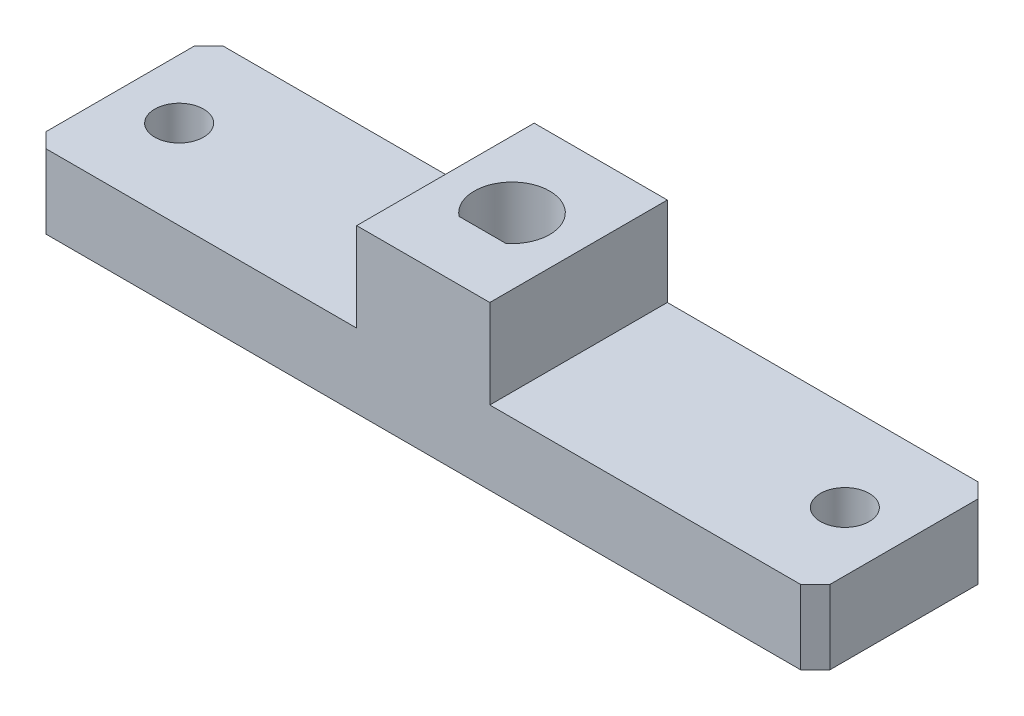
ISO-10303-21;
HEADER;
FILE_DESCRIPTION(('STEP AP214'),'2;1');
FILE_NAME('part.step','',(''),(''),'','','');
FILE_SCHEMA(('AUTOMOTIVE_DESIGN { 1 0 10303 214 1 1 1 1 }'));
ENDSEC;
DATA;
#1=APPLICATION_CONTEXT('core data for automotive mechanical design processes');
#2=APPLICATION_PROTOCOL_DEFINITION('international standard','automotive_design',2000,#1);
#3=PRODUCT_CONTEXT('',#1,'mechanical');
#4=PRODUCT('Part','Part','',(#3));
#5=PRODUCT_RELATED_PRODUCT_CATEGORY('part','',(#4));
#6=PRODUCT_DEFINITION_FORMATION('','',#4);
#7=PRODUCT_DEFINITION_CONTEXT('part definition',#1,'design');
#8=PRODUCT_DEFINITION('design','',#6,#7);
#9=PRODUCT_DEFINITION_SHAPE('','',#8);
#10=(LENGTH_UNIT() NAMED_UNIT(*) SI_UNIT(.MILLI.,.METRE.));
#11=(NAMED_UNIT(*) PLANE_ANGLE_UNIT() SI_UNIT($,.RADIAN.));
#12=(NAMED_UNIT(*) SI_UNIT($,.STERADIAN.) SOLID_ANGLE_UNIT());
#13=UNCERTAINTY_MEASURE_WITH_UNIT(LENGTH_MEASURE(1.E-05),#10,'distance_accuracy_value','');
#14=(GEOMETRIC_REPRESENTATION_CONTEXT(3) GLOBAL_UNCERTAINTY_ASSIGNED_CONTEXT((#13)) GLOBAL_UNIT_ASSIGNED_CONTEXT((#10,
#11,#12)) REPRESENTATION_CONTEXT('',''));
#15=CARTESIAN_POINT('',(0.,0.,0.));
#16=DIRECTION('',(0.,0.,1.));
#17=DIRECTION('',(1.,0.,0.));
#18=AXIS2_PLACEMENT_3D('',#15,#16,#17);
#19=CARTESIAN_POINT('',(4.5,11.,-12.));
#20=DIRECTION('',(0.,1.,0.));
#21=DIRECTION('',(0.,0.,1.));
#22=AXIS2_PLACEMENT_3D('',#19,#20,#21);
#23=PLANE('',#22);
#24=DIRECTION('',(-1.,0.,0.));
#25=VECTOR('',#24,1.);
#26=CARTESIAN_POINT('',(4.5,11.,0.));
#27=LINE('',#26,#25);
#28=CARTESIAN_POINT('',(4.5,11.,0.));
#29=VERTEX_POINT('',#28);
#30=CARTESIAN_POINT('',(-4.5,11.,0.));
#31=VERTEX_POINT('',#30);
#32=EDGE_CURVE('E229',#29,#31,#27,.T.);
#33=ORIENTED_EDGE('',*,*,#32,.F.);
#34=DIRECTION('',(0.,0.,1.));
#35=VECTOR('',#34,1.);
#36=CARTESIAN_POINT('',(4.5,11.,-12.));
#37=LINE('',#36,#35);
#38=CARTESIAN_POINT('',(4.5,11.,-12.));
#39=VERTEX_POINT('',#38);
#40=EDGE_CURVE('E251',#39,#29,#37,.T.);
#41=ORIENTED_EDGE('',*,*,#40,.F.);
#42=DIRECTION('',(-1.,0.,0.));
#43=VECTOR('',#42,1.);
#44=CARTESIAN_POINT('',(4.5,11.,-12.));
#45=LINE('',#44,#43);
#46=CARTESIAN_POINT('',(-4.5,11.,-12.));
#47=VERTEX_POINT('',#46);
#48=EDGE_CURVE('E205',#39,#47,#45,.T.);
#49=ORIENTED_EDGE('',*,*,#48,.T.);
#50=DIRECTION('',(0.,0.,1.));
#51=VECTOR('',#50,1.);
#52=CARTESIAN_POINT('',(-4.5,11.,-12.));
#53=LINE('',#52,#51);
#54=EDGE_CURVE('E248',#47,#31,#53,.T.);
#55=ORIENTED_EDGE('',*,*,#54,.T.);
#56=EDGE_LOOP('',(#33,#41,#49,#55));
#57=FACE_BOUND('',#56,.T.);
#58=DIRECTION('',(1.,0.,0.));
#59=VECTOR('',#58,1.);
#60=CARTESIAN_POINT('',(-1.58192920195564,11.,-4.));
#61=LINE('',#60,#59);
#62=CARTESIAN_POINT('',(-1.58192920195564,11.,-4.));
#63=VERTEX_POINT('',#62);
#64=CARTESIAN_POINT('',(1.58192920195564,11.,-4.));
#65=VERTEX_POINT('',#64);
#66=EDGE_CURVE('E146',#63,#65,#61,.T.);
#67=ORIENTED_EDGE('',*,*,#66,.F.);
#68=CARTESIAN_POINT('',(0.,11.,-6.));
#69=DIRECTION('',(0.,1.,0.));
#70=DIRECTION('',(0.,0.,1.));
#71=AXIS2_PLACEMENT_3D('',#68,#69,#70);
#72=CIRCLE('',#71,2.55);
#73=EDGE_CURVE('E157',#65,#63,#72,.T.);
#74=ORIENTED_EDGE('',*,*,#73,.F.);
#75=EDGE_LOOP('',(#67,#74));
#76=FACE_BOUND('',#75,.T.);
#77=ADVANCED_FACE('F44',(#57,#76),#23,.T.);
#78=CARTESIAN_POINT('',(-26.5,0.,-12.));
#79=DIRECTION('',(0.,-1.,0.));
#80=DIRECTION('',(0.,0.,-1.));
#81=AXIS2_PLACEMENT_3D('',#78,#79,#80);
#82=PLANE('',#81);
#83=CARTESIAN_POINT('',(-22.5,0.,-6.));
#84=DIRECTION('',(0.,-1.,0.));
#85=DIRECTION('',(0.,0.,-1.));
#86=AXIS2_PLACEMENT_3D('',#83,#84,#85);
#87=CIRCLE('',#86,2.025);
#88=CARTESIAN_POINT('',(-22.5,0.,-8.025));
#89=VERTEX_POINT('',#88);
#90=EDGE_CURVE('E175',#89,#89,#87,.T.);
#91=ORIENTED_EDGE('',*,*,#90,.F.);
#92=EDGE_LOOP('',(#91));
#93=FACE_BOUND('',#92,.T.);
#94=CARTESIAN_POINT('',(22.5,0.,-6.00000000000001));
#95=DIRECTION('',(0.,-1.,0.));
#96=DIRECTION('',(0.,0.,-1.));
#97=AXIS2_PLACEMENT_3D('',#94,#95,#96);
#98=CIRCLE('',#97,2.025);
#99=CARTESIAN_POINT('',(22.5,0.,-8.02500000000001));
#100=VERTEX_POINT('',#99);
#101=EDGE_CURVE('E184',#100,#100,#98,.T.);
#102=ORIENTED_EDGE('',*,*,#101,.F.);
#103=EDGE_LOOP('',(#102));
#104=FACE_BOUND('',#103,.T.);
#105=DIRECTION('',(0.,0.,1.));
#106=VECTOR('',#105,1.);
#107=CARTESIAN_POINT('',(-26.5,0.,-12.));
#108=LINE('',#107,#106);
#109=CARTESIAN_POINT('',(-26.5,0.,-11.));
#110=VERTEX_POINT('',#109);
#111=CARTESIAN_POINT('',(-26.5,0.,-1.));
#112=VERTEX_POINT('',#111);
#113=EDGE_CURVE('E217',#110,#112,#108,.T.);
#114=ORIENTED_EDGE('',*,*,#113,.F.);
#115=DIRECTION('',(0.707106781186549,0.,-0.707106781186546));
#116=VECTOR('',#115,1.);
#117=CARTESIAN_POINT('',(-26.,0.,-11.5));
#118=LINE('',#117,#116);
#119=CARTESIAN_POINT('',(-25.5,0.,-12.));
#120=VERTEX_POINT('',#119);
#121=EDGE_CURVE('E289',#110,#120,#118,.T.);
#122=ORIENTED_EDGE('',*,*,#121,.T.);
#123=DIRECTION('',(1.,0.,0.));
#124=VECTOR('',#123,1.);
#125=CARTESIAN_POINT('',(-26.5,0.,-12.));
#126=LINE('',#125,#124);
#127=CARTESIAN_POINT('',(25.5,0.,-12.));
#128=VERTEX_POINT('',#127);
#129=EDGE_CURVE('E193',#120,#128,#126,.T.);
#130=ORIENTED_EDGE('',*,*,#129,.T.);
#131=DIRECTION('',(0.70710678118655,0.,0.707106781186545));
#132=VECTOR('',#131,1.);
#133=CARTESIAN_POINT('',(-0.500000000000184,0.,-38.));
#134=LINE('',#133,#132);
#135=CARTESIAN_POINT('',(26.5,0.,-11.));
#136=VERTEX_POINT('',#135);
#137=EDGE_CURVE('E283',#128,#136,#134,.T.);
#138=ORIENTED_EDGE('',*,*,#137,.T.);
#139=DIRECTION('',(0.,0.,1.));
#140=VECTOR('',#139,1.);
#141=CARTESIAN_POINT('',(26.5,0.,-12.));
#142=LINE('',#141,#140);
#143=CARTESIAN_POINT('',(26.5,0.,-1.));
#144=VERTEX_POINT('',#143);
#145=EDGE_CURVE('E261',#136,#144,#142,.T.);
#146=ORIENTED_EDGE('',*,*,#145,.T.);
#147=DIRECTION('',(0.707106781186548,0.,-0.707106781186548));
#148=VECTOR('',#147,1.);
#149=CARTESIAN_POINT('',(5.5,0.,20.));
#150=LINE('',#149,#148);
#151=CARTESIAN_POINT('',(25.5,0.,0.));
#152=VERTEX_POINT('',#151);
#153=EDGE_CURVE('E280',#144,#152,#150,.F.);
#154=ORIENTED_EDGE('',*,*,#153,.T.);
#155=DIRECTION('',(1.,0.,0.));
#156=VECTOR('',#155,1.);
#157=CARTESIAN_POINT('',(-26.5,0.,0.));
#158=LINE('',#157,#156);
#159=CARTESIAN_POINT('',(-25.5,0.,0.));
#160=VERTEX_POINT('',#159);
#161=EDGE_CURVE('E218',#160,#152,#158,.T.);
#162=ORIENTED_EDGE('',*,*,#161,.F.);
#163=DIRECTION('',(0.707106781186544,0.,0.707106781186551));
#164=VECTOR('',#163,1.);
#165=CARTESIAN_POINT('',(-32.,0.,-6.50000000000006));
#166=LINE('',#165,#164);
#167=EDGE_CURVE('E286',#160,#112,#166,.F.);
#168=ORIENTED_EDGE('',*,*,#167,.T.);
#169=EDGE_LOOP('',(#114,#122,#130,#138,#146,#154,#162,#168));
#170=FACE_BOUND('',#169,.T.);
#171=DIRECTION('',(1.,0.,0.));
#172=VECTOR('',#171,1.);
#173=CARTESIAN_POINT('',(-1.58192920195564,0.,-4.));
#174=LINE('',#173,#172);
#175=CARTESIAN_POINT('',(-1.58192920195564,0.,-4.));
#176=VERTEX_POINT('',#175);
#177=CARTESIAN_POINT('',(1.58192920195564,0.,-4.));
#178=VERTEX_POINT('',#177);
#179=EDGE_CURVE('E166',#176,#178,#174,.T.);
#180=ORIENTED_EDGE('',*,*,#179,.T.);
#181=CARTESIAN_POINT('',(0.,0.,-6.));
#182=DIRECTION('',(0.,1.,0.));
#183=DIRECTION('',(0.,0.,1.));
#184=AXIS2_PLACEMENT_3D('',#181,#182,#183);
#185=CIRCLE('',#184,2.55);
#186=EDGE_CURVE('E162',#178,#176,#185,.T.);
#187=ORIENTED_EDGE('',*,*,#186,.T.);
#188=EDGE_LOOP('',(#180,#187));
#189=FACE_BOUND('',#188,.T.);
#190=ADVANCED_FACE('F334',(#93,#104,#170,#189),#82,.T.);
#191=CARTESIAN_POINT('',(-26.5,5.,-12.));
#192=DIRECTION('',(-1.,0.,0.));
#193=DIRECTION('',(0.,-1.,0.));
#194=AXIS2_PLACEMENT_3D('',#191,#192,#193);
#195=PLANE('',#194);
#196=DIRECTION('',(0.,0.,1.));
#197=VECTOR('',#196,1.);
#198=CARTESIAN_POINT('',(-26.5,5.,-12.));
#199=LINE('',#198,#197);
#200=CARTESIAN_POINT('',(-26.5,5.,-11.));
#201=VERTEX_POINT('',#200);
#202=CARTESIAN_POINT('',(-26.5,5.,-1.));
#203=VERTEX_POINT('',#202);
#204=EDGE_CURVE('E240',#201,#203,#199,.T.);
#205=ORIENTED_EDGE('',*,*,#204,.F.);
#206=DIRECTION('',(0.,-1.,0.));
#207=VECTOR('',#206,1.);
#208=CARTESIAN_POINT('',(-26.5,0.,-11.));
#209=LINE('',#208,#207);
#210=EDGE_CURVE('E276',#201,#110,#209,.T.);
#211=ORIENTED_EDGE('',*,*,#210,.T.);
#212=ORIENTED_EDGE('',*,*,#113,.T.);
#213=DIRECTION('',(0.,1.,0.));
#214=VECTOR('',#213,1.);
#215=CARTESIAN_POINT('',(-26.5,5.,-1.));
#216=LINE('',#215,#214);
#217=EDGE_CURVE('E244',#112,#203,#216,.T.);
#218=ORIENTED_EDGE('',*,*,#217,.T.);
#219=EDGE_LOOP('',(#205,#211,#212,#218));
#220=FACE_BOUND('',#219,.T.);
#221=ADVANCED_FACE('F348',(#220),#195,.T.);
#222=CARTESIAN_POINT('',(-4.5,5.,-12.));
#223=DIRECTION('',(0.,1.,0.));
#224=DIRECTION('',(-1.,0.,0.));
#225=AXIS2_PLACEMENT_3D('',#222,#223,#224);
#226=PLANE('',#225);
#227=CARTESIAN_POINT('',(-22.5,5.,-6.));
#228=DIRECTION('',(0.,1.,0.));
#229=DIRECTION('',(-1.,0.,0.));
#230=AXIS2_PLACEMENT_3D('',#227,#228,#229);
#231=CIRCLE('',#230,1.65);
#232=CARTESIAN_POINT('',(-24.15,5.,-6.));
#233=VERTEX_POINT('',#232);
#234=EDGE_CURVE('E183',#233,#233,#231,.T.);
#235=ORIENTED_EDGE('',*,*,#234,.F.);
#236=EDGE_LOOP('',(#235));
#237=FACE_BOUND('',#236,.T.);
#238=DIRECTION('',(-1.,0.,0.));
#239=VECTOR('',#238,1.);
#240=CARTESIAN_POINT('',(-4.5,5.,-12.));
#241=LINE('',#240,#239);
#242=CARTESIAN_POINT('',(-4.5,5.,-12.));
#243=VERTEX_POINT('',#242);
#244=CARTESIAN_POINT('',(-25.5,5.,-12.));
#245=VERTEX_POINT('',#244);
#246=EDGE_CURVE('E213',#243,#245,#241,.T.);
#247=ORIENTED_EDGE('',*,*,#246,.T.);
#248=DIRECTION('',(-0.707106781186549,0.,0.707106781186546));
#249=VECTOR('',#248,1.);
#250=CARTESIAN_POINT('',(-15.,5.,-22.5));
#251=LINE('',#250,#249);
#252=EDGE_CURVE('E301',#245,#201,#251,.T.);
#253=ORIENTED_EDGE('',*,*,#252,.T.);
#254=ORIENTED_EDGE('',*,*,#204,.T.);
#255=DIRECTION('',(-0.707106781186544,0.,-0.707106781186551));
#256=VECTOR('',#255,1.);
#257=CARTESIAN_POINT('',(-21.0000000000001,5.,4.49999999999994));
#258=LINE('',#257,#256);
#259=CARTESIAN_POINT('',(-25.5,5.,0.));
#260=VERTEX_POINT('',#259);
#261=EDGE_CURVE('E298',#203,#260,#258,.F.);
#262=ORIENTED_EDGE('',*,*,#261,.T.);
#263=DIRECTION('',(-1.,0.,0.));
#264=VECTOR('',#263,1.);
#265=CARTESIAN_POINT('',(-4.5,5.,0.));
#266=LINE('',#265,#264);
#267=CARTESIAN_POINT('',(-4.5,5.,0.));
#268=VERTEX_POINT('',#267);
#269=EDGE_CURVE('E198',#268,#260,#266,.T.);
#270=ORIENTED_EDGE('',*,*,#269,.F.);
#271=DIRECTION('',(0.,0.,1.));
#272=VECTOR('',#271,1.);
#273=CARTESIAN_POINT('',(-4.5,5.,-12.));
#274=LINE('',#273,#272);
#275=EDGE_CURVE('E245',#243,#268,#274,.T.);
#276=ORIENTED_EDGE('',*,*,#275,.F.);
#277=EDGE_LOOP('',(#247,#253,#254,#262,#270,#276));
#278=FACE_BOUND('',#277,.T.);
#279=ADVANCED_FACE('F345',(#237,#278),#226,.T.);
#280=CARTESIAN_POINT('',(-4.5,11.,-12.));
#281=DIRECTION('',(-1.,0.,0.));
#282=DIRECTION('',(0.,-1.,0.));
#283=AXIS2_PLACEMENT_3D('',#280,#281,#282);
#284=PLANE('',#283);
#285=DIRECTION('',(0.,-1.,0.));
#286=VECTOR('',#285,1.);
#287=CARTESIAN_POINT('',(-4.5,11.,0.));
#288=LINE('',#287,#286);
#289=EDGE_CURVE('E233',#31,#268,#288,.T.);
#290=ORIENTED_EDGE('',*,*,#289,.F.);
#291=ORIENTED_EDGE('',*,*,#54,.F.);
#292=DIRECTION('',(0.,-1.,0.));
#293=VECTOR('',#292,1.);
#294=CARTESIAN_POINT('',(-4.5,11.,-12.));
#295=LINE('',#294,#293);
#296=EDGE_CURVE('E209',#47,#243,#295,.T.);
#297=ORIENTED_EDGE('',*,*,#296,.T.);
#298=ORIENTED_EDGE('',*,*,#275,.T.);
#299=EDGE_LOOP('',(#290,#291,#297,#298));
#300=FACE_BOUND('',#299,.T.);
#301=ADVANCED_FACE('F360',(#300),#284,.T.);
#302=CARTESIAN_POINT('',(4.50000000000001,5.00000000000001,-12.));
#303=DIRECTION('',(1.,0.,0.));
#304=DIRECTION('',(0.,1.,0.));
#305=AXIS2_PLACEMENT_3D('',#302,#303,#304);
#306=PLANE('',#305);
#307=DIRECTION('',(0.,1.,0.));
#308=VECTOR('',#307,1.);
#309=CARTESIAN_POINT('',(4.50000000000001,5.00000000000001,0.));
#310=LINE('',#309,#308);
#311=CARTESIAN_POINT('',(4.50000000000001,5.00000000000001,0.));
#312=VERTEX_POINT('',#311);
#313=EDGE_CURVE('E225',#312,#29,#310,.T.);
#314=ORIENTED_EDGE('',*,*,#313,.F.);
#315=DIRECTION('',(0.,0.,1.));
#316=VECTOR('',#315,1.);
#317=CARTESIAN_POINT('',(4.50000000000001,5.00000000000001,-12.));
#318=LINE('',#317,#316);
#319=CARTESIAN_POINT('',(4.50000000000001,5.00000000000001,-12.));
#320=VERTEX_POINT('',#319);
#321=EDGE_CURVE('E254',#320,#312,#318,.T.);
#322=ORIENTED_EDGE('',*,*,#321,.F.);
#323=DIRECTION('',(0.,1.,0.));
#324=VECTOR('',#323,1.);
#325=CARTESIAN_POINT('',(4.50000000000001,5.00000000000001,-12.));
#326=LINE('',#325,#324);
#327=EDGE_CURVE('E201',#320,#39,#326,.T.);
#328=ORIENTED_EDGE('',*,*,#327,.T.);
#329=ORIENTED_EDGE('',*,*,#40,.T.);
#330=EDGE_LOOP('',(#314,#322,#328,#329));
#331=FACE_BOUND('',#330,.T.);
#332=ADVANCED_FACE('F365',(#331),#306,.T.);
#333=CARTESIAN_POINT('',(26.5,5.00000000000003,-12.));
#334=DIRECTION('',(0.,1.,0.));
#335=DIRECTION('',(-1.,0.,0.));
#336=AXIS2_PLACEMENT_3D('',#333,#334,#335);
#337=PLANE('',#336);
#338=CARTESIAN_POINT('',(22.5,5.00000000000003,-6.00000000000001));
#339=DIRECTION('',(0.,1.,0.));
#340=DIRECTION('',(-1.,0.,0.));
#341=AXIS2_PLACEMENT_3D('',#338,#339,#340);
#342=CIRCLE('',#341,1.65);
#343=CARTESIAN_POINT('',(20.85,5.00000000000003,-6.00000000000001));
#344=VERTEX_POINT('',#343);
#345=EDGE_CURVE('E192',#344,#344,#342,.T.);
#346=ORIENTED_EDGE('',*,*,#345,.F.);
#347=EDGE_LOOP('',(#346));
#348=FACE_BOUND('',#347,.T.);
#349=DIRECTION('',(0.,0.,1.));
#350=VECTOR('',#349,1.);
#351=CARTESIAN_POINT('',(26.5,5.00000000000003,-12.));
#352=LINE('',#351,#350);
#353=CARTESIAN_POINT('',(26.5,5.00000000000003,-11.));
#354=VERTEX_POINT('',#353);
#355=CARTESIAN_POINT('',(26.5,5.00000000000003,-1.));
#356=VERTEX_POINT('',#355);
#357=EDGE_CURVE('E258',#354,#356,#352,.T.);
#358=ORIENTED_EDGE('',*,*,#357,.F.);
#359=DIRECTION('',(-0.70710678118655,0.,-0.707106781186545));
#360=VECTOR('',#359,1.);
#361=CARTESIAN_POINT('',(26.,5.00000000000003,-11.5));
#362=LINE('',#361,#360);
#363=CARTESIAN_POINT('',(25.5,5.00000000000003,-12.));
#364=VERTEX_POINT('',#363);
#365=EDGE_CURVE('E11',#354,#364,#362,.T.);
#366=ORIENTED_EDGE('',*,*,#365,.T.);
#367=DIRECTION('',(-1.,0.,0.));
#368=VECTOR('',#367,1.);
#369=CARTESIAN_POINT('',(26.5,5.00000000000003,-12.));
#370=LINE('',#369,#368);
#371=EDGE_CURVE('E197',#364,#320,#370,.T.);
#372=ORIENTED_EDGE('',*,*,#371,.T.);
#373=ORIENTED_EDGE('',*,*,#321,.T.);
#374=DIRECTION('',(-1.,0.,0.));
#375=VECTOR('',#374,1.);
#376=CARTESIAN_POINT('',(26.5,5.00000000000003,0.));
#377=LINE('',#376,#375);
#378=CARTESIAN_POINT('',(25.5,5.00000000000003,0.));
#379=VERTEX_POINT('',#378);
#380=EDGE_CURVE('E222',#379,#312,#377,.T.);
#381=ORIENTED_EDGE('',*,*,#380,.F.);
#382=DIRECTION('',(-0.707106781186548,0.,0.707106781186548));
#383=VECTOR('',#382,1.);
#384=CARTESIAN_POINT('',(32.,5.00000000000004,-6.5));
#385=LINE('',#384,#383);
#386=EDGE_CURVE('E54',#379,#356,#385,.F.);
#387=ORIENTED_EDGE('',*,*,#386,.T.);
#388=EDGE_LOOP('',(#358,#366,#372,#373,#381,#387));
#389=FACE_BOUND('',#388,.T.);
#390=ADVANCED_FACE('F323',(#348,#389),#337,.T.);
#391=CARTESIAN_POINT('',(26.5,0.,-12.));
#392=DIRECTION('',(1.,0.,0.));
#393=DIRECTION('',(0.,1.,0.));
#394=AXIS2_PLACEMENT_3D('',#391,#392,#393);
#395=PLANE('',#394);
#396=ORIENTED_EDGE('',*,*,#145,.F.);
#397=DIRECTION('',(0.,1.,0.));
#398=VECTOR('',#397,1.);
#399=CARTESIAN_POINT('',(26.5,5.00000000000004,-11.));
#400=LINE('',#399,#398);
#401=EDGE_CURVE('E315',#136,#354,#400,.T.);
#402=ORIENTED_EDGE('',*,*,#401,.T.);
#403=ORIENTED_EDGE('',*,*,#357,.T.);
#404=DIRECTION('',(0.,-1.,0.));
#405=VECTOR('',#404,1.);
#406=CARTESIAN_POINT('',(26.5,0.,-1.));
#407=LINE('',#406,#405);
#408=EDGE_CURVE('E312',#356,#144,#407,.T.);
#409=ORIENTED_EDGE('',*,*,#408,.T.);
#410=EDGE_LOOP('',(#396,#402,#403,#409));
#411=FACE_BOUND('',#410,.T.);
#412=ADVANCED_FACE('F320',(#411),#395,.T.);
#413=CARTESIAN_POINT('',(0.,0.,-12.));
#414=DIRECTION('',(0.,0.,1.));
#415=DIRECTION('',(1.,0.,0.));
#416=AXIS2_PLACEMENT_3D('',#413,#414,#415);
#417=PLANE('',#416);
#418=ORIENTED_EDGE('',*,*,#129,.F.);
#419=DIRECTION('',(0.,1.,0.));
#420=VECTOR('',#419,1.);
#421=CARTESIAN_POINT('',(-25.5,5.,-12.));
#422=LINE('',#421,#420);
#423=EDGE_CURVE('E295',#120,#245,#422,.T.);
#424=ORIENTED_EDGE('',*,*,#423,.T.);
#425=ORIENTED_EDGE('',*,*,#246,.F.);
#426=ORIENTED_EDGE('',*,*,#296,.F.);
#427=ORIENTED_EDGE('',*,*,#48,.F.);
#428=ORIENTED_EDGE('',*,*,#327,.F.);
#429=ORIENTED_EDGE('',*,*,#371,.F.);
#430=DIRECTION('',(0.,-1.,0.));
#431=VECTOR('',#430,1.);
#432=CARTESIAN_POINT('',(25.5,0.,-12.));
#433=LINE('',#432,#431);
#434=EDGE_CURVE('E292',#364,#128,#433,.T.);
#435=ORIENTED_EDGE('',*,*,#434,.T.);
#436=EDGE_LOOP('',(#418,#424,#425,#426,#427,#428,#429,#435));
#437=FACE_BOUND('',#436,.T.);
#438=ADVANCED_FACE('F329',(#437),#417,.F.);
#439=CARTESIAN_POINT('',(0.,0.,0.));
#440=DIRECTION('',(0.,0.,1.));
#441=DIRECTION('',(1.,0.,0.));
#442=AXIS2_PLACEMENT_3D('',#439,#440,#441);
#443=PLANE('',#442);
#444=ORIENTED_EDGE('',*,*,#269,.T.);
#445=DIRECTION('',(0.,-1.,0.));
#446=VECTOR('',#445,1.);
#447=CARTESIAN_POINT('',(-25.5,0.,0.));
#448=LINE('',#447,#446);
#449=EDGE_CURVE('E308',#260,#160,#448,.T.);
#450=ORIENTED_EDGE('',*,*,#449,.T.);
#451=ORIENTED_EDGE('',*,*,#161,.T.);
#452=DIRECTION('',(0.,1.,0.));
#453=VECTOR('',#452,1.);
#454=CARTESIAN_POINT('',(25.5,0.,0.));
#455=LINE('',#454,#453);
#456=EDGE_CURVE('E304',#152,#379,#455,.T.);
#457=ORIENTED_EDGE('',*,*,#456,.T.);
#458=ORIENTED_EDGE('',*,*,#380,.T.);
#459=ORIENTED_EDGE('',*,*,#313,.T.);
#460=ORIENTED_EDGE('',*,*,#32,.T.);
#461=ORIENTED_EDGE('',*,*,#289,.T.);
#462=EDGE_LOOP('',(#444,#450,#451,#457,#458,#459,#460,#461));
#463=FACE_BOUND('',#462,.T.);
#464=ADVANCED_FACE('F355',(#463),#443,.T.);
#465=CARTESIAN_POINT('',(22.5,0.,-6.00000000000001));
#466=DIRECTION('',(0.,-1.,0.));
#467=DIRECTION('',(0.,0.,-1.));
#468=AXIS2_PLACEMENT_3D('',#465,#466,#467);
#469=CYLINDRICAL_SURFACE('',#468,1.65);
#470=ORIENTED_EDGE('',*,*,#345,.T.);
#471=EDGE_LOOP('',(#470));
#472=FACE_BOUND('',#471,.T.);
#473=CARTESIAN_POINT('',(22.5,0.375,-6.00000000000001));
#474=DIRECTION('',(0.,-1.,0.));
#475=DIRECTION('',(0.,0.,-1.));
#476=AXIS2_PLACEMENT_3D('',#473,#474,#475);
#477=CIRCLE('',#476,1.65);
#478=CARTESIAN_POINT('',(22.5,0.375,-7.65000000000001));
#479=VERTEX_POINT('',#478);
#480=EDGE_CURVE('E188',#479,#479,#477,.T.);
#481=ORIENTED_EDGE('',*,*,#480,.T.);
#482=EDGE_LOOP('',(#481));
#483=FACE_BOUND('',#482,.T.);
#484=ADVANCED_FACE('F479',(#472,#483),#469,.F.);
#485=CARTESIAN_POINT('',(22.5,0.,-6.00000000000001));
#486=DIRECTION('',(0.,-1.,0.));
#487=DIRECTION('',(0.,0.,-1.));
#488=AXIS2_PLACEMENT_3D('',#485,#486,#487);
#489=CONICAL_SURFACE('',#488,2.025,0.785398163397446);
#490=ORIENTED_EDGE('',*,*,#480,.F.);
#491=EDGE_LOOP('',(#490));
#492=FACE_BOUND('',#491,.T.);
#493=ORIENTED_EDGE('',*,*,#101,.T.);
#494=EDGE_LOOP('',(#493));
#495=FACE_BOUND('',#494,.T.);
#496=ADVANCED_FACE('F469',(#492,#495),#489,.F.);
#497=CARTESIAN_POINT('',(-22.5,0.,-6.));
#498=DIRECTION('',(0.,-1.,0.));
#499=DIRECTION('',(0.,0.,-1.));
#500=AXIS2_PLACEMENT_3D('',#497,#498,#499);
#501=CYLINDRICAL_SURFACE('',#500,1.65);
#502=ORIENTED_EDGE('',*,*,#234,.T.);
#503=EDGE_LOOP('',(#502));
#504=FACE_BOUND('',#503,.T.);
#505=CARTESIAN_POINT('',(-22.5,0.375,-6.));
#506=DIRECTION('',(0.,-1.,0.));
#507=DIRECTION('',(0.,0.,-1.));
#508=AXIS2_PLACEMENT_3D('',#505,#506,#507);
#509=CIRCLE('',#508,1.65);
#510=CARTESIAN_POINT('',(-22.5,0.375,-7.65));
#511=VERTEX_POINT('',#510);
#512=EDGE_CURVE('E179',#511,#511,#509,.T.);
#513=ORIENTED_EDGE('',*,*,#512,.T.);
#514=EDGE_LOOP('',(#513));
#515=FACE_BOUND('',#514,.T.);
#516=ADVANCED_FACE('F459',(#504,#515),#501,.F.);
#517=CARTESIAN_POINT('',(-22.5,0.,-6.));
#518=DIRECTION('',(0.,-1.,0.));
#519=DIRECTION('',(0.,0.,-1.));
#520=AXIS2_PLACEMENT_3D('',#517,#518,#519);
#521=CONICAL_SURFACE('',#520,2.025,0.785398163397446);
#522=ORIENTED_EDGE('',*,*,#512,.F.);
#523=EDGE_LOOP('',(#522));
#524=FACE_BOUND('',#523,.T.);
#525=ORIENTED_EDGE('',*,*,#90,.T.);
#526=EDGE_LOOP('',(#525));
#527=FACE_BOUND('',#526,.T.);
#528=ADVANCED_FACE('F441',(#524,#527),#521,.F.);
#529=CARTESIAN_POINT('',(0.,11.,-6.));
#530=DIRECTION('',(0.,-1.,0.));
#531=DIRECTION('',(0.,0.,-1.));
#532=AXIS2_PLACEMENT_3D('',#529,#530,#531);
#533=CYLINDRICAL_SURFACE('',#532,2.55);
#534=ORIENTED_EDGE('',*,*,#186,.F.);
#535=DIRECTION('',(0.,-1.,0.));
#536=VECTOR('',#535,1.);
#537=CARTESIAN_POINT('',(1.58192920195564,11.,-4.));
#538=LINE('',#537,#536);
#539=EDGE_CURVE('E149',#65,#178,#538,.T.);
#540=ORIENTED_EDGE('',*,*,#539,.F.);
#541=ORIENTED_EDGE('',*,*,#73,.T.);
#542=DIRECTION('',(0.,-1.,0.));
#543=VECTOR('',#542,1.);
#544=CARTESIAN_POINT('',(-1.58192920195564,11.,-4.));
#545=LINE('',#544,#543);
#546=EDGE_CURVE('E152',#63,#176,#545,.T.);
#547=ORIENTED_EDGE('',*,*,#546,.T.);
#548=EDGE_LOOP('',(#534,#540,#541,#547));
#549=FACE_BOUND('',#548,.T.);
#550=ADVANCED_FACE('F160',(#549),#533,.F.);
#551=CARTESIAN_POINT('',(-1.58192920195564,11.,-4.));
#552=DIRECTION('',(0.,0.,-1.));
#553=DIRECTION('',(-1.,0.,0.));
#554=AXIS2_PLACEMENT_3D('',#551,#552,#553);
#555=PLANE('',#554);
#556=ORIENTED_EDGE('',*,*,#179,.F.);
#557=ORIENTED_EDGE('',*,*,#546,.F.);
#558=ORIENTED_EDGE('',*,*,#66,.T.);
#559=ORIENTED_EDGE('',*,*,#539,.T.);
#560=EDGE_LOOP('',(#556,#557,#558,#559));
#561=FACE_BOUND('',#560,.T.);
#562=ADVANCED_FACE('F148',(#561),#555,.T.);
#563=CARTESIAN_POINT('',(-26.5,5.,-11.));
#564=DIRECTION('',(-0.707106781186546,0.,-0.707106781186549));
#565=DIRECTION('',(0.,1.,0.));
#566=AXIS2_PLACEMENT_3D('',#563,#564,#565);
#567=PLANE('',#566);
#568=ORIENTED_EDGE('',*,*,#252,.F.);
#569=ORIENTED_EDGE('',*,*,#423,.F.);
#570=ORIENTED_EDGE('',*,*,#121,.F.);
#571=ORIENTED_EDGE('',*,*,#210,.F.);
#572=EDGE_LOOP('',(#568,#569,#570,#571));
#573=FACE_BOUND('',#572,.T.);
#574=ADVANCED_FACE('F341',(#573),#567,.T.);
#575=CARTESIAN_POINT('',(-25.5,0.,0.));
#576=DIRECTION('',(0.707106781186551,0.,-0.707106781186544));
#577=DIRECTION('',(0.,-1.,0.));
#578=AXIS2_PLACEMENT_3D('',#575,#576,#577);
#579=PLANE('',#578);
#580=ORIENTED_EDGE('',*,*,#261,.F.);
#581=ORIENTED_EDGE('',*,*,#217,.F.);
#582=ORIENTED_EDGE('',*,*,#167,.F.);
#583=ORIENTED_EDGE('',*,*,#449,.F.);
#584=EDGE_LOOP('',(#580,#581,#582,#583));
#585=FACE_BOUND('',#584,.T.);
#586=ADVANCED_FACE('F351',(#585),#579,.F.);
#587=CARTESIAN_POINT('',(26.5,0.,-11.));
#588=DIRECTION('',(0.707106781186545,0.,-0.70710678118655));
#589=DIRECTION('',(0.,-1.,0.));
#590=AXIS2_PLACEMENT_3D('',#587,#588,#589);
#591=PLANE('',#590);
#592=ORIENTED_EDGE('',*,*,#137,.F.);
#593=ORIENTED_EDGE('',*,*,#434,.F.);
#594=ORIENTED_EDGE('',*,*,#365,.F.);
#595=ORIENTED_EDGE('',*,*,#401,.F.);
#596=EDGE_LOOP('',(#592,#593,#594,#595));
#597=FACE_BOUND('',#596,.T.);
#598=ADVANCED_FACE('F331',(#597),#591,.T.);
#599=CARTESIAN_POINT('',(25.5,0.,0.));
#600=DIRECTION('',(-0.707106781186547,0.,-0.707106781186547));
#601=DIRECTION('',(0.,1.,0.));
#602=AXIS2_PLACEMENT_3D('',#599,#600,#601);
#603=PLANE('',#602);
#604=ORIENTED_EDGE('',*,*,#153,.F.);
#605=ORIENTED_EDGE('',*,*,#408,.F.);
#606=ORIENTED_EDGE('',*,*,#386,.F.);
#607=ORIENTED_EDGE('',*,*,#456,.F.);
#608=EDGE_LOOP('',(#604,#605,#606,#607));
#609=FACE_BOUND('',#608,.T.);
#610=ADVANCED_FACE('F47',(#609),#603,.F.);
#611=CLOSED_SHELL('',(#77,#190,#221,#279,#301,#332,#390,#412,#438,#464,#484,#496,#516,#528,#550,
#562,#574,#586,#598,#610));
#612=MANIFOLD_SOLID_BREP('B2',#611);
#613=ADVANCED_BREP_SHAPE_REPRESENTATION('',(#18,#612),#14);
#614=SHAPE_DEFINITION_REPRESENTATION(#9,#613);
ENDSEC;
END-ISO-10303-21;
